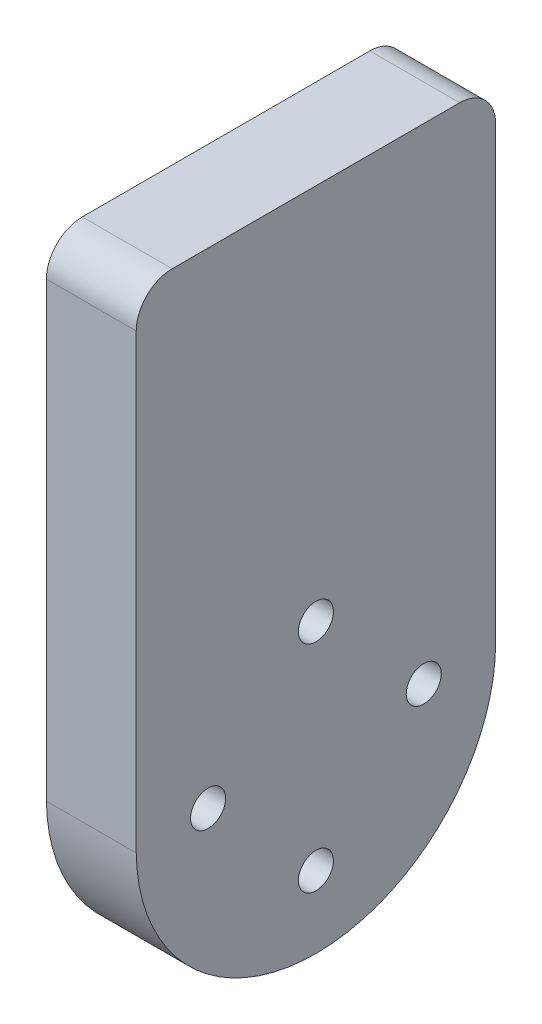
ISO-10303-21;
HEADER;
FILE_DESCRIPTION(('STEP AP214'),'2;1');
FILE_NAME('part.step','',(''),(''),'','','');
FILE_SCHEMA(('AUTOMOTIVE_DESIGN { 1 0 10303 214 1 1 1 1 }'));
ENDSEC;
DATA;
#1=APPLICATION_CONTEXT('core data for automotive mechanical design processes');
#2=APPLICATION_PROTOCOL_DEFINITION('international standard','automotive_design',2000,#1);
#3=PRODUCT_CONTEXT('',#1,'mechanical');
#4=PRODUCT('Part','Part','',(#3));
#5=PRODUCT_RELATED_PRODUCT_CATEGORY('part','',(#4));
#6=PRODUCT_DEFINITION_FORMATION('','',#4);
#7=PRODUCT_DEFINITION_CONTEXT('part definition',#1,'design');
#8=PRODUCT_DEFINITION('design','',#6,#7);
#9=PRODUCT_DEFINITION_SHAPE('','',#8);
#10=(LENGTH_UNIT() NAMED_UNIT(*) SI_UNIT(.MILLI.,.METRE.));
#11=(NAMED_UNIT(*) PLANE_ANGLE_UNIT() SI_UNIT($,.RADIAN.));
#12=(NAMED_UNIT(*) SI_UNIT($,.STERADIAN.) SOLID_ANGLE_UNIT());
#13=UNCERTAINTY_MEASURE_WITH_UNIT(LENGTH_MEASURE(1.E-05),#10,'distance_accuracy_value','');
#14=(GEOMETRIC_REPRESENTATION_CONTEXT(3) GLOBAL_UNCERTAINTY_ASSIGNED_CONTEXT((#13)) GLOBAL_UNIT_ASSIGNED_CONTEXT((#10,
#11,#12)) REPRESENTATION_CONTEXT('',''));
#15=CARTESIAN_POINT('',(0.,0.,0.));
#16=DIRECTION('',(0.,0.,1.));
#17=DIRECTION('',(1.,0.,0.));
#18=AXIS2_PLACEMENT_3D('',#15,#16,#17);
#19=CARTESIAN_POINT('',(-363.38948823165,8.02676551199148E-12,69.997708477632));
#20=DIRECTION('',(9.45910016980634E-13,0.,1.));
#21=DIRECTION('',(-1.,0.,9.45910016980634E-13));
#22=AXIS2_PLACEMENT_3D('',#19,#20,#21);
#23=PLANE('',#22);
#24=DIRECTION('',(3.56745438819933E-13,1.,0.));
#25=VECTOR('',#24,1.);
#26=CARTESIAN_POINT('',(-353.38948823165,4.45932155270355E-12,69.9977084776225));
#27=LINE('',#26,#25);
#28=CARTESIAN_POINT('',(-353.38948823165,-0.302746842975293,69.9977084776225));
#29=VERTEX_POINT('',#28);
#30=CARTESIAN_POINT('',(-353.389488231632,50.0000000000225,69.9977084776225));
#31=VERTEX_POINT('',#30);
#32=EDGE_CURVE('E131',#29,#31,#27,.T.);
#33=ORIENTED_EDGE('',*,*,#32,.T.);
#34=DIRECTION('',(1.,-3.56744395928794E-13,-9.45910016980634E-13));
#35=VECTOR('',#34,1.);
#36=CARTESIAN_POINT('',(-363.389488231632,50.000000000026,69.997708477632));
#37=LINE('',#36,#35);
#38=CARTESIAN_POINT('',(-363.389488231632,50.000000000026,69.997708477632));
#39=VERTEX_POINT('',#38);
#40=EDGE_CURVE('E118',#39,#31,#37,.T.);
#41=ORIENTED_EDGE('',*,*,#40,.F.);
#42=DIRECTION('',(3.56745438819933E-13,1.,0.));
#43=VECTOR('',#42,1.);
#44=CARTESIAN_POINT('',(-363.38948823165,8.02676551199148E-12,69.997708477632));
#45=LINE('',#44,#43);
#46=CARTESIAN_POINT('',(-363.38948823165,-0.302746842971725,69.997708477632));
#47=VERTEX_POINT('',#46);
#48=EDGE_CURVE('E156',#47,#39,#45,.T.);
#49=ORIENTED_EDGE('',*,*,#48,.F.);
#50=DIRECTION('',(1.,-3.56744395928794E-13,-9.45910016980634E-13));
#51=VECTOR('',#50,1.);
#52=CARTESIAN_POINT('',(-363.38948823165,-0.302746842971725,69.997708477632));
#53=LINE('',#52,#51);
#54=EDGE_CURVE('E11',#47,#29,#53,.T.);
#55=ORIENTED_EDGE('',*,*,#54,.T.);
#56=EDGE_LOOP('',(#33,#41,#49,#55));
#57=FACE_BOUND('',#56,.T.);
#58=ADVANCED_FACE('F35',(#57),#23,.T.);
#59=CARTESIAN_POINT('',(-363.389488231669,2.60483398243995E-11,50.0000000001825));
#60=DIRECTION('',(1.,-3.56744395928794E-13,-9.45910016980634E-13));
#61=DIRECTION('',(-3.56744395928794E-13,-1.,0.));
#62=AXIS2_PLACEMENT_3D('',#59,#60,#61);
#63=CYLINDRICAL_SURFACE('',#62,19.9999999999997);
#64=CARTESIAN_POINT('',(-353.389488231669,2.24808958651116E-11,50.0000000001731));
#65=DIRECTION('',(1.,-3.56745438819933E-13,-9.45910016980634E-13));
#66=DIRECTION('',(3.56745438819933E-13,1.,0.));
#67=AXIS2_PLACEMENT_3D('',#64,#65,#66);
#68=CIRCLE('',#67,19.9999999999997);
#69=CARTESIAN_POINT('',(-353.389488231688,2.24822836438924E-11,30.0000000001732));
#70=VERTEX_POINT('',#69);
#71=EDGE_CURVE('E134',#29,#70,#68,.T.);
#72=ORIENTED_EDGE('',*,*,#71,.F.);
#73=ORIENTED_EDGE('',*,*,#54,.F.);
#74=CARTESIAN_POINT('',(-363.389488231669,2.60483398243995E-11,50.0000000001825));
#75=DIRECTION('',(1.,-3.56745438819933E-13,-9.45910016980634E-13));
#76=DIRECTION('',(3.56745438819933E-13,1.,0.));
#77=AXIS2_PLACEMENT_3D('',#74,#75,#76);
#78=CIRCLE('',#77,19.9999999999997);
#79=CARTESIAN_POINT('',(-363.389488231688,2.60497276031803E-11,30.0000000001826));
#80=VERTEX_POINT('',#79);
#81=EDGE_CURVE('E84',#47,#80,#78,.T.);
#82=ORIENTED_EDGE('',*,*,#81,.T.);
#83=DIRECTION('',(1.,-3.56744395928794E-13,-9.45910016980634E-13));
#84=VECTOR('',#83,1.);
#85=CARTESIAN_POINT('',(-363.389488231688,2.60497276031803E-11,30.0000000001826));
#86=LINE('',#85,#84);
#87=EDGE_CURVE('E44',#80,#70,#86,.T.);
#88=ORIENTED_EDGE('',*,*,#87,.T.);
#89=EDGE_LOOP('',(#72,#73,#82,#88));
#90=FACE_BOUND('',#89,.T.);
#91=ADVANCED_FACE('F149',(#90),#63,.T.);
#92=CARTESIAN_POINT('',(-363.389488231688,8.02468384382031E-12,30.0000000001825));
#93=DIRECTION('',(-9.45910016980634E-13,0.,-1.));
#94=DIRECTION('',(0.,1.,0.));
#95=AXIS2_PLACEMENT_3D('',#92,#93,#94);
#96=PLANE('',#95);
#97=DIRECTION('',(-3.56745438819933E-13,-1.,0.));
#98=VECTOR('',#97,1.);
#99=CARTESIAN_POINT('',(-353.389488231688,4.45723988453237E-12,30.000000000173));
#100=LINE('',#99,#98);
#101=CARTESIAN_POINT('',(-353.38948823167,50.0000000000225,30.0000000001731));
#102=VERTEX_POINT('',#101);
#103=EDGE_CURVE('E137',#102,#70,#100,.T.);
#104=ORIENTED_EDGE('',*,*,#103,.T.);
#105=ORIENTED_EDGE('',*,*,#87,.F.);
#106=DIRECTION('',(-3.56745438819933E-13,-1.,0.));
#107=VECTOR('',#106,1.);
#108=CARTESIAN_POINT('',(-363.389488231688,8.02468384382031E-12,30.0000000001825));
#109=LINE('',#108,#107);
#110=CARTESIAN_POINT('',(-363.38948823167,50.000000000026,30.0000000001825));
#111=VERTEX_POINT('',#110);
#112=EDGE_CURVE('E112',#111,#80,#109,.T.);
#113=ORIENTED_EDGE('',*,*,#112,.F.);
#114=DIRECTION('',(1.,-3.56744395928794E-13,-9.45910016980634E-13));
#115=VECTOR('',#114,1.);
#116=CARTESIAN_POINT('',(-363.38948823167,50.000000000026,30.0000000001825));
#117=LINE('',#116,#115);
#118=EDGE_CURVE('E106',#111,#102,#117,.T.);
#119=ORIENTED_EDGE('',*,*,#118,.T.);
#120=EDGE_LOOP('',(#104,#105,#113,#119));
#121=FACE_BOUND('',#120,.T.);
#122=ADVANCED_FACE('F202',(#121),#96,.T.);
#123=CARTESIAN_POINT('',(-363.389488231666,50.000000000026,34.0000000001825));
#124=DIRECTION('',(1.,-3.56744395928794E-13,-9.45910016980634E-13));
#125=DIRECTION('',(-3.56744395928794E-13,-1.,0.));
#126=AXIS2_PLACEMENT_3D('',#123,#124,#125);
#127=CYLINDRICAL_SURFACE('',#126,4.);
#128=CARTESIAN_POINT('',(-353.389488231666,50.0000000000225,34.0000000001731));
#129=DIRECTION('',(1.,-3.56745438819933E-13,-9.45910016980634E-13));
#130=DIRECTION('',(3.56745438819933E-13,1.,0.));
#131=AXIS2_PLACEMENT_3D('',#128,#129,#130);
#132=CIRCLE('',#131,4.);
#133=CARTESIAN_POINT('',(-353.389488231664,54.0000000000225,34.0000000001731));
#134=VERTEX_POINT('',#133);
#135=EDGE_CURVE('E139',#134,#102,#132,.F.);
#136=ORIENTED_EDGE('',*,*,#135,.T.);
#137=ORIENTED_EDGE('',*,*,#118,.F.);
#138=CARTESIAN_POINT('',(-363.389488231666,50.000000000026,34.0000000001825));
#139=DIRECTION('',(1.,-3.56745438819933E-13,-9.45910016980634E-13));
#140=DIRECTION('',(3.56745438819933E-13,1.,0.));
#141=AXIS2_PLACEMENT_3D('',#138,#139,#140);
#142=CIRCLE('',#141,4.);
#143=CARTESIAN_POINT('',(-363.389488231665,54.000000000026,34.0000000001825));
#144=VERTEX_POINT('',#143);
#145=EDGE_CURVE('E96',#144,#111,#142,.F.);
#146=ORIENTED_EDGE('',*,*,#145,.F.);
#147=DIRECTION('',(1.,-3.56744395928794E-13,-9.45910016980634E-13));
#148=VECTOR('',#147,1.);
#149=CARTESIAN_POINT('',(-363.389488231665,54.000000000026,34.0000000001825));
#150=LINE('',#149,#148);
#151=EDGE_CURVE('E101',#144,#134,#150,.T.);
#152=ORIENTED_EDGE('',*,*,#151,.T.);
#153=EDGE_LOOP('',(#136,#137,#146,#152));
#154=FACE_BOUND('',#153,.T.);
#155=ADVANCED_FACE('F109',(#154),#127,.T.);
#156=CARTESIAN_POINT('',(-363.389488231697,54.000000000026,1.82496660690454E-10));
#157=DIRECTION('',(3.56744395928794E-13,1.,0.));
#158=DIRECTION('',(1.,-3.56744395928794E-13,-9.45910016980634E-13));
#159=AXIS2_PLACEMENT_3D('',#156,#157,#158);
#160=PLANE('',#159);
#161=DIRECTION('',(-9.45910016980634E-13,0.,-1.));
#162=VECTOR('',#161,1.);
#163=CARTESIAN_POINT('',(-353.389488231697,54.0000000000225,1.73037560520648E-10));
#164=LINE('',#163,#162);
#165=CARTESIAN_POINT('',(-353.389488231634,54.0000000000225,65.9977084776225));
#166=VERTEX_POINT('',#165);
#167=EDGE_CURVE('E103',#166,#134,#164,.T.);
#168=ORIENTED_EDGE('',*,*,#167,.T.);
#169=ORIENTED_EDGE('',*,*,#151,.F.);
#170=DIRECTION('',(-9.45910016980634E-13,0.,-1.));
#171=VECTOR('',#170,1.);
#172=CARTESIAN_POINT('',(-363.389488231697,54.000000000026,1.82496660690454E-10));
#173=LINE('',#172,#171);
#174=CARTESIAN_POINT('',(-363.389488231634,54.000000000026,65.997708477632));
#175=VERTEX_POINT('',#174);
#176=EDGE_CURVE('E92',#175,#144,#173,.T.);
#177=ORIENTED_EDGE('',*,*,#176,.F.);
#178=DIRECTION('',(1.,-3.56744395928794E-13,-9.45910016980634E-13));
#179=VECTOR('',#178,1.);
#180=CARTESIAN_POINT('',(-363.389488231634,54.000000000026,65.997708477632));
#181=LINE('',#180,#179);
#182=EDGE_CURVE('E107',#175,#166,#181,.T.);
#183=ORIENTED_EDGE('',*,*,#182,.T.);
#184=EDGE_LOOP('',(#168,#169,#177,#183));
#185=FACE_BOUND('',#184,.T.);
#186=ADVANCED_FACE('F102',(#185),#160,.T.);
#187=CARTESIAN_POINT('',(-363.389488231664,11.9999999999905,50.0000000001825));
#188=DIRECTION('',(1.,-3.56744395928794E-13,-9.45910016980634E-13));
#189=DIRECTION('',(-3.56744395928794E-13,-1.,0.));
#190=AXIS2_PLACEMENT_3D('',#187,#188,#189);
#191=CYLINDRICAL_SURFACE('',#190,1.95);
#192=CARTESIAN_POINT('',(-363.389488231664,11.9999999999905,50.0000000001825));
#193=DIRECTION('',(1.,-3.56745438819933E-13,-9.45910016980634E-13));
#194=DIRECTION('',(3.56745438819933E-13,1.,0.));
#195=AXIS2_PLACEMENT_3D('',#192,#193,#194);
#196=CIRCLE('',#195,1.95);
#197=CARTESIAN_POINT('',(-363.389488231664,13.9499999999905,50.0000000001825));
#198=VERTEX_POINT('',#197);
#199=EDGE_CURVE('E157',#198,#198,#196,.F.);
#200=ORIENTED_EDGE('',*,*,#199,.T.);
#201=EDGE_LOOP('',(#200));
#202=FACE_BOUND('',#201,.T.);
#203=CARTESIAN_POINT('',(-353.389488231664,11.999999999987,50.0000000001731));
#204=DIRECTION('',(1.,-3.56745438819933E-13,-9.45910016980634E-13));
#205=DIRECTION('',(3.56745438819933E-13,1.,0.));
#206=AXIS2_PLACEMENT_3D('',#203,#204,#205);
#207=CIRCLE('',#206,1.95);
#208=CARTESIAN_POINT('',(-353.389488231664,13.949999999987,50.0000000001731));
#209=VERTEX_POINT('',#208);
#210=EDGE_CURVE('E128',#209,#209,#207,.F.);
#211=ORIENTED_EDGE('',*,*,#210,.F.);
#212=EDGE_LOOP('',(#211));
#213=FACE_BOUND('',#212,.T.);
#214=ADVANCED_FACE('F183',(#202,#213),#191,.F.);
#215=CARTESIAN_POINT('',(-363.389488231657,8.02675247584182E-12,62.000000000183));
#216=DIRECTION('',(1.,-3.56744395928794E-13,-9.45910016980634E-13));
#217=DIRECTION('',(-3.56744395928794E-13,-1.,0.));
#218=AXIS2_PLACEMENT_3D('',#215,#216,#217);
#219=CYLINDRICAL_SURFACE('',#218,1.95);
#220=CARTESIAN_POINT('',(-363.389488231657,8.02675247584182E-12,62.000000000183));
#221=DIRECTION('',(1.,-3.56745438819933E-13,-9.45910016980634E-13));
#222=DIRECTION('',(3.56745438819933E-13,1.,0.));
#223=AXIS2_PLACEMENT_3D('',#220,#221,#222);
#224=CIRCLE('',#223,1.95);
#225=CARTESIAN_POINT('',(-363.389488231657,1.95000000000803,62.000000000183));
#226=VERTEX_POINT('',#225);
#227=EDGE_CURVE('E160',#226,#226,#224,.F.);
#228=ORIENTED_EDGE('',*,*,#227,.T.);
#229=EDGE_LOOP('',(#228));
#230=FACE_BOUND('',#229,.T.);
#231=CARTESIAN_POINT('',(-353.389488231657,4.45930851655388E-12,62.0000000001736));
#232=DIRECTION('',(1.,-3.56745438819933E-13,-9.45910016980634E-13));
#233=DIRECTION('',(3.56745438819933E-13,1.,0.));
#234=AXIS2_PLACEMENT_3D('',#231,#232,#233);
#235=CIRCLE('',#234,1.95);
#236=CARTESIAN_POINT('',(-353.389488231657,1.95000000000446,62.0000000001736));
#237=VERTEX_POINT('',#236);
#238=EDGE_CURVE('E125',#237,#237,#235,.F.);
#239=ORIENTED_EDGE('',*,*,#238,.F.);
#240=EDGE_LOOP('',(#239));
#241=FACE_BOUND('',#240,.T.);
#242=ADVANCED_FACE('F186',(#230,#241),#219,.F.);
#243=CARTESIAN_POINT('',(-363.38948823168,8.02675247584182E-12,38.000000000182));
#244=DIRECTION('',(1.,-3.56744395928794E-13,-9.45910016980634E-13));
#245=DIRECTION('',(-3.56744395928794E-13,-1.,0.));
#246=AXIS2_PLACEMENT_3D('',#243,#244,#245);
#247=CYLINDRICAL_SURFACE('',#246,1.95);
#248=CARTESIAN_POINT('',(-363.38948823168,8.02675247584182E-12,38.000000000182));
#249=DIRECTION('',(1.,-3.56745438819933E-13,-9.45910016980634E-13));
#250=DIRECTION('',(3.56745438819933E-13,1.,0.));
#251=AXIS2_PLACEMENT_3D('',#248,#249,#250);
#252=CIRCLE('',#251,1.95);
#253=CARTESIAN_POINT('',(-363.389488231679,1.95000000000803,38.000000000182));
#254=VERTEX_POINT('',#253);
#255=EDGE_CURVE('E165',#254,#254,#252,.F.);
#256=ORIENTED_EDGE('',*,*,#255,.T.);
#257=EDGE_LOOP('',(#256));
#258=FACE_BOUND('',#257,.T.);
#259=CARTESIAN_POINT('',(-353.38948823168,4.45930851655388E-12,38.0000000001725));
#260=DIRECTION('',(1.,-3.56745438819933E-13,-9.45910016980634E-13));
#261=DIRECTION('',(3.56745438819933E-13,1.,0.));
#262=AXIS2_PLACEMENT_3D('',#259,#260,#261);
#263=CIRCLE('',#262,1.95);
#264=CARTESIAN_POINT('',(-353.389488231679,1.95000000000446,38.0000000001725));
#265=VERTEX_POINT('',#264);
#266=EDGE_CURVE('E122',#265,#265,#263,.F.);
#267=ORIENTED_EDGE('',*,*,#266,.F.);
#268=EDGE_LOOP('',(#267));
#269=FACE_BOUND('',#268,.T.);
#270=ADVANCED_FACE('F207',(#258,#269),#247,.F.);
#271=CARTESIAN_POINT('',(-363.389488231673,-11.9999999999745,50.0000000001825));
#272=DIRECTION('',(1.,-3.56744395928794E-13,-9.45910016980634E-13));
#273=DIRECTION('',(-3.56744395928794E-13,-1.,0.));
#274=AXIS2_PLACEMENT_3D('',#271,#272,#273);
#275=CYLINDRICAL_SURFACE('',#274,1.95);
#276=CARTESIAN_POINT('',(-363.389488231673,-11.9999999999745,50.0000000001825));
#277=DIRECTION('',(1.,-3.56745438819933E-13,-9.45910016980634E-13));
#278=DIRECTION('',(3.56745438819933E-13,1.,0.));
#279=AXIS2_PLACEMENT_3D('',#276,#277,#278);
#280=CIRCLE('',#279,1.95);
#281=CARTESIAN_POINT('',(-363.389488231672,-10.0499999999745,50.0000000001825));
#282=VERTEX_POINT('',#281);
#283=EDGE_CURVE('E143',#282,#282,#280,.F.);
#284=ORIENTED_EDGE('',*,*,#283,.T.);
#285=EDGE_LOOP('',(#284));
#286=FACE_BOUND('',#285,.T.);
#287=CARTESIAN_POINT('',(-353.389488231673,-11.999999999978,50.0000000001731));
#288=DIRECTION('',(1.,-3.56745438819933E-13,-9.45910016980634E-13));
#289=DIRECTION('',(3.56745438819933E-13,1.,0.));
#290=AXIS2_PLACEMENT_3D('',#287,#288,#289);
#291=CIRCLE('',#290,1.95);
#292=CARTESIAN_POINT('',(-353.389488231672,-10.049999999978,50.0000000001731));
#293=VERTEX_POINT('',#292);
#294=EDGE_CURVE('E119',#293,#293,#291,.F.);
#295=ORIENTED_EDGE('',*,*,#294,.F.);
#296=EDGE_LOOP('',(#295));
#297=FACE_BOUND('',#296,.T.);
#298=ADVANCED_FACE('F37',(#286,#297),#275,.F.);
#299=CARTESIAN_POINT('',(-363.389488231636,50.000000000026,65.997708477632));
#300=DIRECTION('',(1.,-3.56744395928794E-13,-9.45910016980634E-13));
#301=DIRECTION('',(-3.56744395928794E-13,-1.,0.));
#302=AXIS2_PLACEMENT_3D('',#299,#300,#301);
#303=CYLINDRICAL_SURFACE('',#302,4.);
#304=CARTESIAN_POINT('',(-353.389488231636,50.0000000000225,65.9977084776225));
#305=DIRECTION('',(1.,-3.56745438819933E-13,-9.45910016980634E-13));
#306=DIRECTION('',(3.56745438819933E-13,1.,0.));
#307=AXIS2_PLACEMENT_3D('',#304,#305,#306);
#308=CIRCLE('',#307,4.);
#309=EDGE_CURVE('E72',#31,#166,#308,.F.);
#310=ORIENTED_EDGE('',*,*,#309,.T.);
#311=ORIENTED_EDGE('',*,*,#182,.F.);
#312=CARTESIAN_POINT('',(-363.389488231636,50.000000000026,65.997708477632));
#313=DIRECTION('',(1.,-3.56745438819933E-13,-9.45910016980634E-13));
#314=DIRECTION('',(3.56745438819933E-13,1.,0.));
#315=AXIS2_PLACEMENT_3D('',#312,#313,#314);
#316=CIRCLE('',#315,4.);
#317=EDGE_CURVE('E52',#39,#175,#316,.F.);
#318=ORIENTED_EDGE('',*,*,#317,.F.);
#319=ORIENTED_EDGE('',*,*,#40,.T.);
#320=EDGE_LOOP('',(#310,#311,#318,#319));
#321=FACE_BOUND('',#320,.T.);
#322=ADVANCED_FACE('F175',(#321),#303,.T.);
#323=CARTESIAN_POINT('',(-363.389488231716,8.02676551199148E-12,1.82508370912505E-10));
#324=DIRECTION('',(-1.,3.56745438819933E-13,9.45910016980634E-13));
#325=DIRECTION('',(3.56745438819933E-13,1.,0.));
#326=AXIS2_PLACEMENT_3D('',#323,#324,#325);
#327=PLANE('',#326);
#328=ORIENTED_EDGE('',*,*,#283,.F.);
#329=EDGE_LOOP('',(#328));
#330=FACE_BOUND('',#329,.T.);
#331=ORIENTED_EDGE('',*,*,#255,.F.);
#332=EDGE_LOOP('',(#331));
#333=FACE_BOUND('',#332,.T.);
#334=ORIENTED_EDGE('',*,*,#227,.F.);
#335=EDGE_LOOP('',(#334));
#336=FACE_BOUND('',#335,.T.);
#337=ORIENTED_EDGE('',*,*,#199,.F.);
#338=EDGE_LOOP('',(#337));
#339=FACE_BOUND('',#338,.T.);
#340=ORIENTED_EDGE('',*,*,#48,.T.);
#341=ORIENTED_EDGE('',*,*,#317,.T.);
#342=ORIENTED_EDGE('',*,*,#176,.T.);
#343=ORIENTED_EDGE('',*,*,#145,.T.);
#344=ORIENTED_EDGE('',*,*,#112,.T.);
#345=ORIENTED_EDGE('',*,*,#81,.F.);
#346=EDGE_LOOP('',(#340,#341,#342,#343,#344,#345));
#347=FACE_BOUND('',#346,.T.);
#348=ADVANCED_FACE('F94',(#330,#333,#336,#339,#347),#327,.T.);
#349=CARTESIAN_POINT('',(-353.389488231716,4.45932155270355E-12,1.73049270742699E-10));
#350=DIRECTION('',(-1.,3.56745438819933E-13,9.45910016980634E-13));
#351=DIRECTION('',(3.56745438819933E-13,1.,0.));
#352=AXIS2_PLACEMENT_3D('',#349,#350,#351);
#353=PLANE('',#352);
#354=ORIENTED_EDGE('',*,*,#294,.T.);
#355=EDGE_LOOP('',(#354));
#356=FACE_BOUND('',#355,.T.);
#357=ORIENTED_EDGE('',*,*,#266,.T.);
#358=EDGE_LOOP('',(#357));
#359=FACE_BOUND('',#358,.T.);
#360=ORIENTED_EDGE('',*,*,#238,.T.);
#361=EDGE_LOOP('',(#360));
#362=FACE_BOUND('',#361,.T.);
#363=ORIENTED_EDGE('',*,*,#210,.T.);
#364=EDGE_LOOP('',(#363));
#365=FACE_BOUND('',#364,.T.);
#366=ORIENTED_EDGE('',*,*,#32,.F.);
#367=ORIENTED_EDGE('',*,*,#71,.T.);
#368=ORIENTED_EDGE('',*,*,#103,.F.);
#369=ORIENTED_EDGE('',*,*,#135,.F.);
#370=ORIENTED_EDGE('',*,*,#167,.F.);
#371=ORIENTED_EDGE('',*,*,#309,.F.);
#372=EDGE_LOOP('',(#366,#367,#368,#369,#370,#371));
#373=FACE_BOUND('',#372,.T.);
#374=ADVANCED_FACE('F152',(#356,#359,#362,#365,#373),#353,.F.);
#375=CLOSED_SHELL('',(#58,#91,#122,#155,#186,#214,#242,#270,#298,#322,#348,#374));
#376=MANIFOLD_SOLID_BREP('B2',#375);
#377=ADVANCED_BREP_SHAPE_REPRESENTATION('',(#18,#376),#14);
#378=SHAPE_DEFINITION_REPRESENTATION(#9,#377);
ENDSEC;
END-ISO-10303-21;
